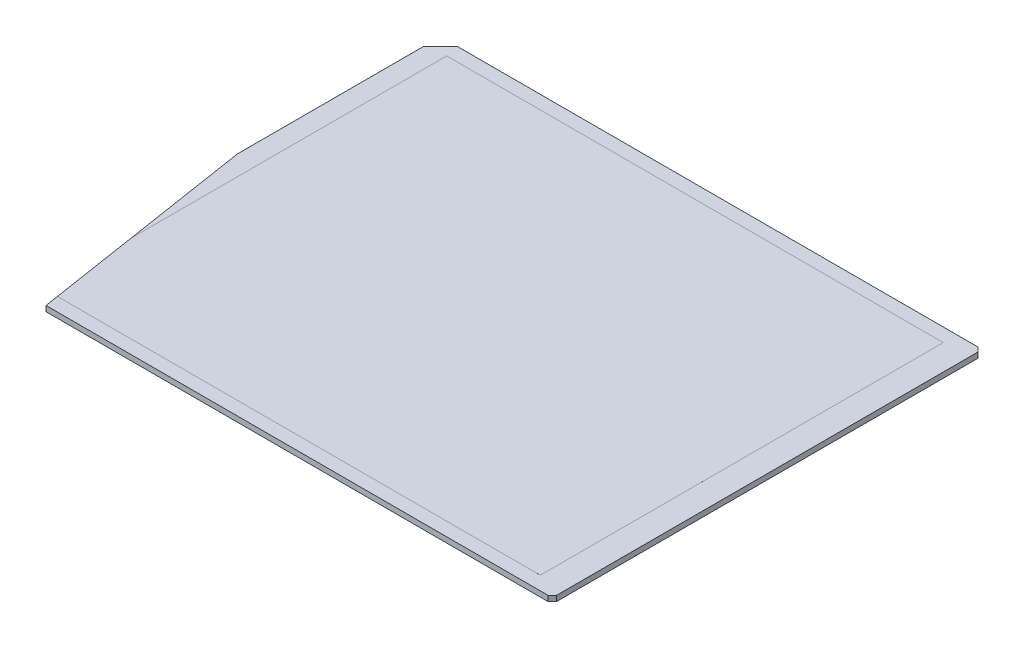
ISO-10303-21;
HEADER;
FILE_DESCRIPTION(('STEP AP214'),'2;1');
FILE_NAME('part.step','',(''),(''),'','','');
FILE_SCHEMA(('AUTOMOTIVE_DESIGN { 1 0 10303 214 1 1 1 1 }'));
ENDSEC;
DATA;
#1=APPLICATION_CONTEXT('core data for automotive mechanical design processes');
#2=APPLICATION_PROTOCOL_DEFINITION('international standard','automotive_design',2000,#1);
#3=PRODUCT_CONTEXT('',#1,'mechanical');
#4=PRODUCT('Part','Part','',(#3));
#5=PRODUCT_RELATED_PRODUCT_CATEGORY('part','',(#4));
#6=PRODUCT_DEFINITION_FORMATION('','',#4);
#7=PRODUCT_DEFINITION_CONTEXT('part definition',#1,'design');
#8=PRODUCT_DEFINITION('design','',#6,#7);
#9=PRODUCT_DEFINITION_SHAPE('','',#8);
#10=(LENGTH_UNIT() NAMED_UNIT(*) SI_UNIT(.MILLI.,.METRE.));
#11=(NAMED_UNIT(*) PLANE_ANGLE_UNIT() SI_UNIT($,.RADIAN.));
#12=(NAMED_UNIT(*) SI_UNIT($,.STERADIAN.) SOLID_ANGLE_UNIT());
#13=UNCERTAINTY_MEASURE_WITH_UNIT(LENGTH_MEASURE(1.E-05),#10,'distance_accuracy_value','');
#14=(GEOMETRIC_REPRESENTATION_CONTEXT(3) GLOBAL_UNCERTAINTY_ASSIGNED_CONTEXT((#13)) GLOBAL_UNIT_ASSIGNED_CONTEXT((#10,
#11,#12)) REPRESENTATION_CONTEXT('',''));
#15=CARTESIAN_POINT('',(0.,0.,0.));
#16=DIRECTION('',(0.,0.,1.));
#17=DIRECTION('',(1.,0.,0.));
#18=AXIS2_PLACEMENT_3D('',#15,#16,#17);
#19=CARTESIAN_POINT('',(-80.01,1.6,-63.5));
#20=DIRECTION('',(1.,0.,0.));
#21=DIRECTION('',(0.,0.,-1.));
#22=AXIS2_PLACEMENT_3D('',#19,#20,#21);
#23=PLANE('',#22);
#24=DIRECTION('',(0.,-1.,0.));
#25=VECTOR('',#24,1.);
#26=CARTESIAN_POINT('',(-80.01,256.973504828439,-3.50000000000003));
#27=LINE('',#26,#25);
#28=CARTESIAN_POINT('',(-80.01,1.59989999999999,-3.50000000000003));
#29=VERTEX_POINT('',#28);
#30=CARTESIAN_POINT('',(-80.01,0.,-3.50000000000003));
#31=VERTEX_POINT('',#30);
#32=EDGE_CURVE('E135',#29,#31,#27,.T.);
#33=ORIENTED_EDGE('',*,*,#32,.F.);
#34=DIRECTION('',(0.,0.,1.));
#35=VECTOR('',#34,1.);
#36=CARTESIAN_POINT('',(-80.01,1.5999,-63.5));
#37=LINE('',#36,#35);
#38=CARTESIAN_POINT('',(-80.01,1.5999,-58.5));
#39=VERTEX_POINT('',#38);
#40=EDGE_CURVE('E151',#39,#29,#37,.T.);
#41=ORIENTED_EDGE('',*,*,#40,.F.);
#42=DIRECTION('',(0.,-1.,0.));
#43=VECTOR('',#42,1.);
#44=CARTESIAN_POINT('',(-80.01,1.6,-58.5));
#45=LINE('',#44,#43);
#46=CARTESIAN_POINT('',(-80.01,0.,-58.5));
#47=VERTEX_POINT('',#46);
#48=EDGE_CURVE('E170',#39,#47,#45,.T.);
#49=ORIENTED_EDGE('',*,*,#48,.T.);
#50=DIRECTION('',(0.,0.,1.));
#51=VECTOR('',#50,1.);
#52=CARTESIAN_POINT('',(-80.01,0.,-63.5));
#53=LINE('',#52,#51);
#54=EDGE_CURVE('E165',#47,#31,#53,.T.);
#55=ORIENTED_EDGE('',*,*,#54,.T.);
#56=EDGE_LOOP('',(#33,#41,#49,#55));
#57=FACE_BOUND('',#56,.T.);
#58=ADVANCED_FACE('F32',(#57),#23,.F.);
#59=CARTESIAN_POINT('',(-80.01,1.6,63.5));
#60=DIRECTION('',(0.,0.,-1.));
#61=DIRECTION('',(-1.,0.,0.));
#62=AXIS2_PLACEMENT_3D('',#59,#60,#61);
#63=PLANE('',#62);
#64=DIRECTION('',(0.,-1.,0.));
#65=VECTOR('',#64,1.);
#66=CARTESIAN_POINT('',(-69.51,256.973504828439,63.5));
#67=LINE('',#66,#65);
#68=CARTESIAN_POINT('',(-69.51,1.59989999999999,63.5));
#69=VERTEX_POINT('',#68);
#70=CARTESIAN_POINT('',(-69.51,0.,63.5));
#71=VERTEX_POINT('',#70);
#72=EDGE_CURVE('E126',#69,#71,#67,.T.);
#73=ORIENTED_EDGE('',*,*,#72,.T.);
#74=DIRECTION('',(1.,0.,0.));
#75=VECTOR('',#74,1.);
#76=CARTESIAN_POINT('',(-80.01,0.,63.5));
#77=LINE('',#76,#75);
#78=CARTESIAN_POINT('',(78.7400000000001,0.,63.5));
#79=VERTEX_POINT('',#78);
#80=EDGE_CURVE('E168',#71,#79,#77,.T.);
#81=ORIENTED_EDGE('',*,*,#80,.T.);
#82=DIRECTION('',(0.,1.,0.));
#83=VECTOR('',#82,1.);
#84=CARTESIAN_POINT('',(78.7400000000001,1.6,63.5));
#85=LINE('',#84,#83);
#86=CARTESIAN_POINT('',(78.74,1.5999,63.5));
#87=VERTEX_POINT('',#86);
#88=EDGE_CURVE('E150',#79,#87,#85,.T.);
#89=ORIENTED_EDGE('',*,*,#88,.T.);
#90=DIRECTION('',(1.,0.,0.));
#91=VECTOR('',#90,1.);
#92=CARTESIAN_POINT('',(-80.01,1.5999,63.5));
#93=LINE('',#92,#91);
#94=EDGE_CURVE('E141',#69,#87,#93,.T.);
#95=ORIENTED_EDGE('',*,*,#94,.F.);
#96=EDGE_LOOP('',(#73,#81,#89,#95));
#97=FACE_BOUND('',#96,.T.);
#98=ADVANCED_FACE('F148',(#97),#63,.F.);
#99=CARTESIAN_POINT('',(80.01,0.,63.5));
#100=DIRECTION('',(0.,1.,0.));
#101=DIRECTION('',(0.,0.,1.));
#102=AXIS2_PLACEMENT_3D('',#99,#100,#101);
#103=PLANE('',#102);
#104=DIRECTION('',(0.154826676217066,0.,0.987941648242231));
#105=VECTOR('',#104,1.);
#106=CARTESIAN_POINT('',(-65.9258112735773,0.,86.3705375876502));
#107=LINE('',#106,#105);
#108=EDGE_CURVE('E131',#31,#71,#107,.T.);
#109=ORIENTED_EDGE('',*,*,#108,.F.);
#110=ORIENTED_EDGE('',*,*,#54,.F.);
#111=DIRECTION('',(-0.707106781186549,0.,0.707106781186546));
#112=VECTOR('',#111,1.);
#113=CARTESIAN_POINT('',(-80.01,0.,-58.5));
#114=LINE('',#113,#112);
#115=CARTESIAN_POINT('',(-75.01,0.,-63.5));
#116=VERTEX_POINT('',#115);
#117=EDGE_CURVE('E172',#47,#116,#114,.F.);
#118=ORIENTED_EDGE('',*,*,#117,.T.);
#119=DIRECTION('',(-1.,0.,0.));
#120=VECTOR('',#119,1.);
#121=CARTESIAN_POINT('',(-80.01,0.,-63.5));
#122=LINE('',#121,#120);
#123=CARTESIAN_POINT('',(78.7399999999999,0.,-63.5));
#124=VERTEX_POINT('',#123);
#125=EDGE_CURVE('E163',#124,#116,#122,.T.);
#126=ORIENTED_EDGE('',*,*,#125,.F.);
#127=DIRECTION('',(-0.707106781186548,0.,-0.707106781186548));
#128=VECTOR('',#127,1.);
#129=CARTESIAN_POINT('',(78.74,0.,-63.5));
#130=LINE('',#129,#128);
#131=CARTESIAN_POINT('',(80.01,0.,-62.23));
#132=VERTEX_POINT('',#131);
#133=EDGE_CURVE('E183',#124,#132,#130,.F.);
#134=ORIENTED_EDGE('',*,*,#133,.T.);
#135=DIRECTION('',(0.,0.,-1.));
#136=VECTOR('',#135,1.);
#137=CARTESIAN_POINT('',(80.01,0.,-63.5));
#138=LINE('',#137,#136);
#139=CARTESIAN_POINT('',(80.01,0.,62.23));
#140=VERTEX_POINT('',#139);
#141=EDGE_CURVE('E154',#140,#132,#138,.T.);
#142=ORIENTED_EDGE('',*,*,#141,.F.);
#143=DIRECTION('',(0.707106781186544,0.,-0.707106781186551));
#144=VECTOR('',#143,1.);
#145=CARTESIAN_POINT('',(80.01,0.,62.23));
#146=LINE('',#145,#144);
#147=EDGE_CURVE('E185',#140,#79,#146,.F.);
#148=ORIENTED_EDGE('',*,*,#147,.T.);
#149=ORIENTED_EDGE('',*,*,#80,.F.);
#150=EDGE_LOOP('',(#109,#110,#118,#126,#134,#142,#148,#149));
#151=FACE_BOUND('',#150,.T.);
#152=ADVANCED_FACE('F204',(#151),#103,.F.);
#153=CARTESIAN_POINT('',(0.,1.5999,0.));
#154=DIRECTION('',(0.,1.,0.));
#155=DIRECTION('',(0.,0.,1.));
#156=AXIS2_PLACEMENT_3D('',#153,#154,#155);
#157=PLANE('',#156);
#158=ORIENTED_EDGE('',*,*,#40,.T.);
#159=DIRECTION('',(0.154826676217066,0.,0.987941648242231));
#160=VECTOR('',#159,1.);
#161=CARTESIAN_POINT('',(-77.5566972876013,1.5999,12.1544077838778));
#162=LINE('',#161,#160);
#163=CARTESIAN_POINT('',(-74.1649344505304,1.5999,33.797084934711));
#164=VERTEX_POINT('',#163);
#165=EDGE_CURVE('E145',#29,#164,#162,.T.);
#166=ORIENTED_EDGE('',*,*,#165,.T.);
#167=DIRECTION('',(0.,0.,1.));
#168=VECTOR('',#167,1.);
#169=CARTESIAN_POINT('',(-74.1649344505304,1.5999,59.5));
#170=LINE('',#169,#168);
#171=CARTESIAN_POINT('',(-74.1649344505304,1.5999,-59.5));
#172=VERTEX_POINT('',#171);
#173=EDGE_CURVE('E298',#172,#164,#170,.T.);
#174=ORIENTED_EDGE('',*,*,#173,.F.);
#175=DIRECTION('',(-1.,0.,0.));
#176=VECTOR('',#175,1.);
#177=CARTESIAN_POINT('',(72.4805203195643,1.5999,-59.5));
#178=LINE('',#177,#176);
#179=CARTESIAN_POINT('',(72.4805203195643,1.5999,-59.5));
#180=VERTEX_POINT('',#179);
#181=EDGE_CURVE('E300',#180,#172,#178,.T.);
#182=ORIENTED_EDGE('',*,*,#181,.F.);
#183=DIRECTION('',(0.,0.,-1.));
#184=VECTOR('',#183,1.);
#185=CARTESIAN_POINT('',(72.4805203195644,1.5999,59.5));
#186=LINE('',#185,#184);
#187=CARTESIAN_POINT('',(72.4805203195644,1.5999,59.5));
#188=VERTEX_POINT('',#187);
#189=EDGE_CURVE('E296',#188,#180,#186,.T.);
#190=ORIENTED_EDGE('',*,*,#189,.F.);
#191=DIRECTION('',(1.,0.,0.));
#192=VECTOR('',#191,1.);
#193=CARTESIAN_POINT('',(72.4805203195644,1.5999,59.5));
#194=LINE('',#193,#192);
#195=CARTESIAN_POINT('',(-70.1368656716418,1.5999,59.5));
#196=VERTEX_POINT('',#195);
#197=EDGE_CURVE('E144',#196,#188,#194,.T.);
#198=ORIENTED_EDGE('',*,*,#197,.F.);
#199=EDGE_CURVE('E129',#196,#69,#162,.T.);
#200=ORIENTED_EDGE('',*,*,#199,.T.);
#201=ORIENTED_EDGE('',*,*,#94,.T.);
#202=DIRECTION('',(0.707106781186544,0.,-0.707106781186551));
#203=VECTOR('',#202,1.);
#204=CARTESIAN_POINT('',(80.01,1.5999,62.23));
#205=LINE('',#204,#203);
#206=CARTESIAN_POINT('',(80.01,1.5999,62.23));
#207=VERTEX_POINT('',#206);
#208=EDGE_CURVE('E157',#207,#87,#205,.F.);
#209=ORIENTED_EDGE('',*,*,#208,.F.);
#210=DIRECTION('',(0.,0.,-1.));
#211=VECTOR('',#210,1.);
#212=CARTESIAN_POINT('',(80.01,1.5999,-63.5));
#213=LINE('',#212,#211);
#214=CARTESIAN_POINT('',(80.01,1.5999,-62.23));
#215=VERTEX_POINT('',#214);
#216=EDGE_CURVE('E199',#207,#215,#213,.T.);
#217=ORIENTED_EDGE('',*,*,#216,.T.);
#218=DIRECTION('',(-0.707106781186548,0.,-0.707106781186548));
#219=VECTOR('',#218,1.);
#220=CARTESIAN_POINT('',(78.74,1.5999,-63.5));
#221=LINE('',#220,#219);
#222=CARTESIAN_POINT('',(78.74,1.5999,-63.5));
#223=VERTEX_POINT('',#222);
#224=EDGE_CURVE('E40',#223,#215,#221,.F.);
#225=ORIENTED_EDGE('',*,*,#224,.F.);
#226=DIRECTION('',(-1.,0.,0.));
#227=VECTOR('',#226,1.);
#228=CARTESIAN_POINT('',(-80.01,1.5999,-63.5));
#229=LINE('',#228,#227);
#230=CARTESIAN_POINT('',(-75.01,1.5999,-63.5));
#231=VERTEX_POINT('',#230);
#232=EDGE_CURVE('E211',#223,#231,#229,.T.);
#233=ORIENTED_EDGE('',*,*,#232,.T.);
#234=DIRECTION('',(-0.707106781186549,0.,0.707106781186546));
#235=VECTOR('',#234,1.);
#236=CARTESIAN_POINT('',(-80.01,1.5999,-58.5));
#237=LINE('',#236,#235);
#238=EDGE_CURVE('E152',#39,#231,#237,.F.);
#239=ORIENTED_EDGE('',*,*,#238,.F.);
#240=EDGE_LOOP('',(#158,#166,#174,#182,#190,#198,#200,#201,#209,#217,#225,#233,#239));
#241=FACE_BOUND('',#240,.T.);
#242=ADVANCED_FACE('F140',(#241),#157,.T.);
#243=CARTESIAN_POINT('',(72.4805203195644,1.5999,59.5));
#244=DIRECTION('',(0.,0.,1.));
#245=DIRECTION('',(1.,0.,0.));
#246=AXIS2_PLACEMENT_3D('',#243,#244,#245);
#247=PLANE('',#246);
#248=DIRECTION('',(1.,0.,0.));
#249=VECTOR('',#248,1.);
#250=CARTESIAN_POINT('',(72.4805203195644,1.6,59.5));
#251=LINE('',#250,#249);
#252=CARTESIAN_POINT('',(-70.1368656716419,1.6,59.5));
#253=VERTEX_POINT('',#252);
#254=CARTESIAN_POINT('',(72.4805203195644,1.6,59.5));
#255=VERTEX_POINT('',#254);
#256=EDGE_CURVE('E295',#253,#255,#251,.T.);
#257=ORIENTED_EDGE('',*,*,#256,.F.);
#258=DIRECTION('',(0.,-1.,0.));
#259=VECTOR('',#258,1.);
#260=CARTESIAN_POINT('',(-70.1368656716418,1.5999,59.5));
#261=LINE('',#260,#259);
#262=EDGE_CURVE('E47',#253,#196,#261,.T.);
#263=ORIENTED_EDGE('',*,*,#262,.T.);
#264=ORIENTED_EDGE('',*,*,#197,.T.);
#265=DIRECTION('',(0.,1.,0.));
#266=VECTOR('',#265,1.);
#267=CARTESIAN_POINT('',(72.4805203195644,1.5999,59.5));
#268=LINE('',#267,#266);
#269=EDGE_CURVE('E212',#188,#255,#268,.T.);
#270=ORIENTED_EDGE('',*,*,#269,.T.);
#271=EDGE_LOOP('',(#257,#263,#264,#270));
#272=FACE_BOUND('',#271,.T.);
#273=ADVANCED_FACE('F255',(#272),#247,.T.);
#274=CARTESIAN_POINT('',(-74.1649344505304,1.5999,59.5));
#275=DIRECTION('',(-1.,0.,0.));
#276=DIRECTION('',(0.,0.,1.));
#277=AXIS2_PLACEMENT_3D('',#274,#275,#276);
#278=PLANE('',#277);
#279=ORIENTED_EDGE('',*,*,#173,.T.);
#280=DIRECTION('',(0.,1.,0.));
#281=VECTOR('',#280,1.);
#282=CARTESIAN_POINT('',(-74.1649344505304,1.5999,33.797084934711));
#283=LINE('',#282,#281);
#284=CARTESIAN_POINT('',(-74.1649344505304,1.6,33.7970849347111));
#285=VERTEX_POINT('',#284);
#286=EDGE_CURVE('E305',#164,#285,#283,.T.);
#287=ORIENTED_EDGE('',*,*,#286,.T.);
#288=DIRECTION('',(0.,0.,1.));
#289=VECTOR('',#288,1.);
#290=CARTESIAN_POINT('',(-74.1649344505304,1.6,59.5));
#291=LINE('',#290,#289);
#292=CARTESIAN_POINT('',(-74.1649344505304,1.6,-59.5));
#293=VERTEX_POINT('',#292);
#294=EDGE_CURVE('E54',#293,#285,#291,.T.);
#295=ORIENTED_EDGE('',*,*,#294,.F.);
#296=DIRECTION('',(0.,1.,0.));
#297=VECTOR('',#296,1.);
#298=CARTESIAN_POINT('',(-74.1649344505304,1.5999,-59.5));
#299=LINE('',#298,#297);
#300=EDGE_CURVE('E216',#172,#293,#299,.T.);
#301=ORIENTED_EDGE('',*,*,#300,.F.);
#302=EDGE_LOOP('',(#279,#287,#295,#301));
#303=FACE_BOUND('',#302,.T.);
#304=ADVANCED_FACE('F249',(#303),#278,.T.);
#305=CARTESIAN_POINT('',(80.01,1.6,63.5));
#306=DIRECTION('',(0.,1.,0.));
#307=DIRECTION('',(0.,0.,1.));
#308=AXIS2_PLACEMENT_3D('',#305,#306,#307);
#309=PLANE('',#308);
#310=ORIENTED_EDGE('',*,*,#294,.T.);
#311=DIRECTION('',(0.154826676217066,0.,0.987941648242231));
#312=VECTOR('',#311,1.);
#313=CARTESIAN_POINT('',(-65.9258112735773,1.6,86.3705375876502));
#314=LINE('',#313,#312);
#315=EDGE_CURVE('E13',#285,#253,#314,.T.);
#316=ORIENTED_EDGE('',*,*,#315,.T.);
#317=ORIENTED_EDGE('',*,*,#256,.T.);
#318=DIRECTION('',(0.,0.,-1.));
#319=VECTOR('',#318,1.);
#320=CARTESIAN_POINT('',(72.4805203195644,1.6,59.5));
#321=LINE('',#320,#319);
#322=CARTESIAN_POINT('',(72.4805203195643,1.6,-59.5));
#323=VERTEX_POINT('',#322);
#324=EDGE_CURVE('E283',#255,#323,#321,.T.);
#325=ORIENTED_EDGE('',*,*,#324,.T.);
#326=DIRECTION('',(-1.,0.,0.));
#327=VECTOR('',#326,1.);
#328=CARTESIAN_POINT('',(72.4805203195643,1.6,-59.5));
#329=LINE('',#328,#327);
#330=EDGE_CURVE('E287',#323,#293,#329,.T.);
#331=ORIENTED_EDGE('',*,*,#330,.T.);
#332=EDGE_LOOP('',(#310,#316,#317,#325,#331));
#333=FACE_BOUND('',#332,.T.);
#334=ADVANCED_FACE('F245',(#333),#309,.T.);
#335=CARTESIAN_POINT('',(80.01,1.6,-63.5));
#336=DIRECTION('',(-1.,0.,0.));
#337=DIRECTION('',(0.,0.,1.));
#338=AXIS2_PLACEMENT_3D('',#335,#336,#337);
#339=PLANE('',#338);
#340=ORIENTED_EDGE('',*,*,#216,.F.);
#341=DIRECTION('',(0.,-1.,0.));
#342=VECTOR('',#341,1.);
#343=CARTESIAN_POINT('',(80.01,1.6,62.23));
#344=LINE('',#343,#342);
#345=EDGE_CURVE('E181',#207,#140,#344,.T.);
#346=ORIENTED_EDGE('',*,*,#345,.T.);
#347=ORIENTED_EDGE('',*,*,#141,.T.);
#348=DIRECTION('',(0.,1.,0.));
#349=VECTOR('',#348,1.);
#350=CARTESIAN_POINT('',(80.01,1.6,-62.23));
#351=LINE('',#350,#349);
#352=EDGE_CURVE('E178',#132,#215,#351,.T.);
#353=ORIENTED_EDGE('',*,*,#352,.T.);
#354=EDGE_LOOP('',(#340,#346,#347,#353));
#355=FACE_BOUND('',#354,.T.);
#356=ADVANCED_FACE('F198',(#355),#339,.F.);
#357=CARTESIAN_POINT('',(-80.01,1.6,-63.5));
#358=DIRECTION('',(0.,0.,1.));
#359=DIRECTION('',(1.,0.,0.));
#360=AXIS2_PLACEMENT_3D('',#357,#358,#359);
#361=PLANE('',#360);
#362=ORIENTED_EDGE('',*,*,#232,.F.);
#363=DIRECTION('',(0.,-1.,0.));
#364=VECTOR('',#363,1.);
#365=CARTESIAN_POINT('',(78.74,1.6,-63.5));
#366=LINE('',#365,#364);
#367=EDGE_CURVE('E189',#223,#124,#366,.T.);
#368=ORIENTED_EDGE('',*,*,#367,.T.);
#369=ORIENTED_EDGE('',*,*,#125,.T.);
#370=DIRECTION('',(0.,1.,0.));
#371=VECTOR('',#370,1.);
#372=CARTESIAN_POINT('',(-75.01,1.6,-63.5));
#373=LINE('',#372,#371);
#374=EDGE_CURVE('E175',#116,#231,#373,.T.);
#375=ORIENTED_EDGE('',*,*,#374,.T.);
#376=EDGE_LOOP('',(#362,#368,#369,#375));
#377=FACE_BOUND('',#376,.T.);
#378=ADVANCED_FACE('F210',(#377),#361,.F.);
#379=CARTESIAN_POINT('',(-80.01,1.6,-58.5));
#380=DIRECTION('',(0.707106781186546,0.,0.707106781186549));
#381=DIRECTION('',(0.707106781186549,0.,-0.707106781186546));
#382=AXIS2_PLACEMENT_3D('',#379,#380,#381);
#383=PLANE('',#382);
#384=ORIENTED_EDGE('',*,*,#48,.F.);
#385=ORIENTED_EDGE('',*,*,#238,.T.);
#386=ORIENTED_EDGE('',*,*,#374,.F.);
#387=ORIENTED_EDGE('',*,*,#117,.F.);
#388=EDGE_LOOP('',(#384,#385,#386,#387));
#389=FACE_BOUND('',#388,.T.);
#390=ADVANCED_FACE('F224',(#389),#383,.F.);
#391=CARTESIAN_POINT('',(80.01,1.6,62.23));
#392=DIRECTION('',(-0.707106781186551,0.,-0.707106781186544));
#393=DIRECTION('',(-0.707106781186544,0.,0.707106781186551));
#394=AXIS2_PLACEMENT_3D('',#391,#392,#393);
#395=PLANE('',#394);
#396=ORIENTED_EDGE('',*,*,#345,.F.);
#397=ORIENTED_EDGE('',*,*,#208,.T.);
#398=ORIENTED_EDGE('',*,*,#88,.F.);
#399=ORIENTED_EDGE('',*,*,#147,.F.);
#400=EDGE_LOOP('',(#396,#397,#398,#399));
#401=FACE_BOUND('',#400,.T.);
#402=ADVANCED_FACE('F222',(#401),#395,.F.);
#403=CARTESIAN_POINT('',(78.74,1.6,-63.5));
#404=DIRECTION('',(-0.707106781186548,0.,0.707106781186548));
#405=DIRECTION('',(0.707106781186548,0.,0.707106781186548));
#406=AXIS2_PLACEMENT_3D('',#403,#404,#405);
#407=PLANE('',#406);
#408=ORIENTED_EDGE('',*,*,#367,.F.);
#409=ORIENTED_EDGE('',*,*,#224,.T.);
#410=ORIENTED_EDGE('',*,*,#352,.F.);
#411=ORIENTED_EDGE('',*,*,#133,.F.);
#412=EDGE_LOOP('',(#408,#409,#410,#411));
#413=FACE_BOUND('',#412,.T.);
#414=ADVANCED_FACE('F34',(#413),#407,.F.);
#415=CARTESIAN_POINT('',(72.4805203195644,1.5999,59.5));
#416=DIRECTION('',(1.,0.,0.));
#417=DIRECTION('',(0.,0.,-1.));
#418=AXIS2_PLACEMENT_3D('',#415,#416,#417);
#419=PLANE('',#418);
#420=ORIENTED_EDGE('',*,*,#324,.F.);
#421=ORIENTED_EDGE('',*,*,#269,.F.);
#422=ORIENTED_EDGE('',*,*,#189,.T.);
#423=DIRECTION('',(0.,1.,0.));
#424=VECTOR('',#423,1.);
#425=CARTESIAN_POINT('',(72.4805203195643,1.5999,-59.5));
#426=LINE('',#425,#424);
#427=EDGE_CURVE('E219',#180,#323,#426,.T.);
#428=ORIENTED_EDGE('',*,*,#427,.T.);
#429=EDGE_LOOP('',(#420,#421,#422,#428));
#430=FACE_BOUND('',#429,.T.);
#431=ADVANCED_FACE('F229',(#430),#419,.T.);
#432=CARTESIAN_POINT('',(72.4805203195643,1.5999,-59.5));
#433=DIRECTION('',(0.,0.,-1.));
#434=DIRECTION('',(-1.,0.,0.));
#435=AXIS2_PLACEMENT_3D('',#432,#433,#434);
#436=PLANE('',#435);
#437=ORIENTED_EDGE('',*,*,#330,.F.);
#438=ORIENTED_EDGE('',*,*,#427,.F.);
#439=ORIENTED_EDGE('',*,*,#181,.T.);
#440=ORIENTED_EDGE('',*,*,#300,.T.);
#441=EDGE_LOOP('',(#437,#438,#439,#440));
#442=FACE_BOUND('',#441,.T.);
#443=ADVANCED_FACE('F273',(#442),#436,.T.);
#444=CARTESIAN_POINT('',(-69.51,256.973504828439,63.5));
#445=DIRECTION('',(-0.987941648242231,0.,0.154826676217066));
#446=DIRECTION('',(0.154826676217066,0.,0.987941648242231));
#447=AXIS2_PLACEMENT_3D('',#444,#445,#446);
#448=PLANE('',#447);
#449=ORIENTED_EDGE('',*,*,#32,.T.);
#450=ORIENTED_EDGE('',*,*,#108,.T.);
#451=ORIENTED_EDGE('',*,*,#72,.F.);
#452=ORIENTED_EDGE('',*,*,#199,.F.);
#453=ORIENTED_EDGE('',*,*,#262,.F.);
#454=ORIENTED_EDGE('',*,*,#315,.F.);
#455=ORIENTED_EDGE('',*,*,#286,.F.);
#456=ORIENTED_EDGE('',*,*,#165,.F.);
#457=EDGE_LOOP('',(#449,#450,#451,#452,#453,#454,#455,#456));
#458=FACE_BOUND('',#457,.T.);
#459=ADVANCED_FACE('F128',(#458),#448,.T.);
#460=CLOSED_SHELL('',(#58,#98,#152,#242,#273,#304,#334,#356,#378,#390,#402,#414,#431,#443,#459));
#461=MANIFOLD_SOLID_BREP('B2',#460);
#462=ADVANCED_BREP_SHAPE_REPRESENTATION('',(#18,#461),#14);
#463=SHAPE_DEFINITION_REPRESENTATION(#9,#462);
ENDSEC;
END-ISO-10303-21;
